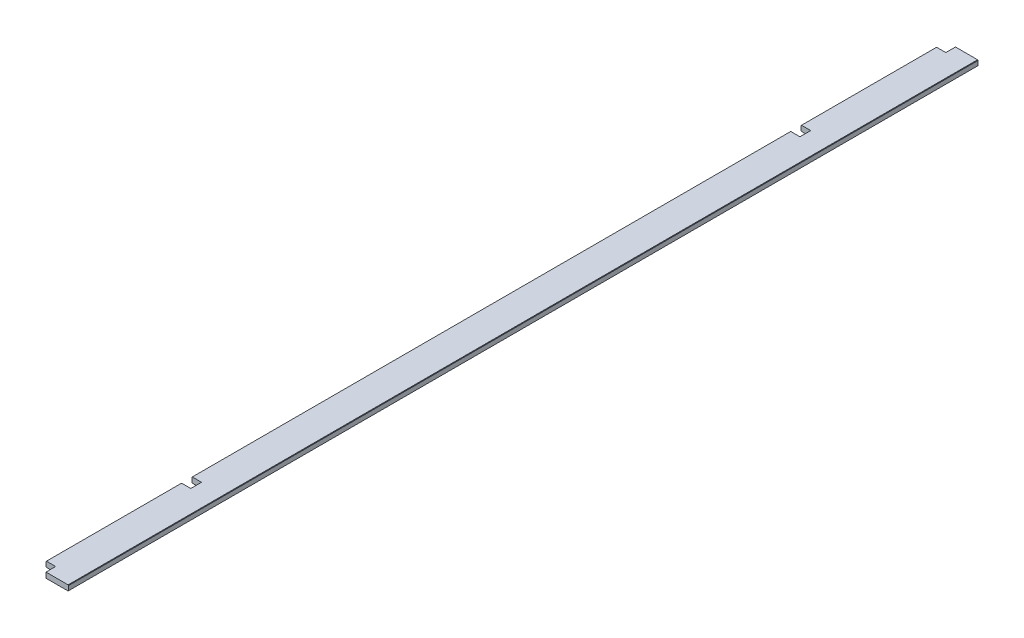
ISO-10303-21;
HEADER;
FILE_DESCRIPTION(('STEP AP214'),'2;1');
FILE_NAME('part.step','',(''),(''),'','','');
FILE_SCHEMA(('AUTOMOTIVE_DESIGN { 1 0 10303 214 1 1 1 1 }'));
ENDSEC;
DATA;
#1=APPLICATION_CONTEXT('core data for automotive mechanical design processes');
#2=APPLICATION_PROTOCOL_DEFINITION('international standard','automotive_design',2000,#1);
#3=PRODUCT_CONTEXT('',#1,'mechanical');
#4=PRODUCT('Part','Part','',(#3));
#5=PRODUCT_RELATED_PRODUCT_CATEGORY('part','',(#4));
#6=PRODUCT_DEFINITION_FORMATION('','',#4);
#7=PRODUCT_DEFINITION_CONTEXT('part definition',#1,'design');
#8=PRODUCT_DEFINITION('design','',#6,#7);
#9=PRODUCT_DEFINITION_SHAPE('','',#8);
#10=(LENGTH_UNIT() NAMED_UNIT(*) SI_UNIT(.MILLI.,.METRE.));
#11=(NAMED_UNIT(*) PLANE_ANGLE_UNIT() SI_UNIT($,.RADIAN.));
#12=(NAMED_UNIT(*) SI_UNIT($,.STERADIAN.) SOLID_ANGLE_UNIT());
#13=UNCERTAINTY_MEASURE_WITH_UNIT(LENGTH_MEASURE(1.E-05),#10,'distance_accuracy_value','');
#14=(GEOMETRIC_REPRESENTATION_CONTEXT(3) GLOBAL_UNCERTAINTY_ASSIGNED_CONTEXT((#13)) GLOBAL_UNIT_ASSIGNED_CONTEXT((#10,
#11,#12)) REPRESENTATION_CONTEXT('',''));
#15=CARTESIAN_POINT('',(0.,0.,0.));
#16=DIRECTION('',(0.,0.,1.));
#17=DIRECTION('',(1.,0.,0.));
#18=AXIS2_PLACEMENT_3D('',#15,#16,#17);
#19=CARTESIAN_POINT('',(-75.,10.5,4240.));
#20=DIRECTION('',(0.707106781186547,-0.707106781186548,0.));
#21=DIRECTION('',(0.707106781186548,0.707106781186547,0.));
#22=AXIS2_PLACEMENT_3D('',#19,#20,#21);
#23=PLANE('',#22);
#24=DIRECTION('',(0.,0.,-1.));
#25=VECTOR('',#24,1.);
#26=CARTESIAN_POINT('',(-75.,10.5,4240.));
#27=LINE('',#26,#25);
#28=CARTESIAN_POINT('',(-75.,10.5,3515.));
#29=VERTEX_POINT('',#28);
#30=CARTESIAN_POINT('',(-75.,10.5,725.));
#31=VERTEX_POINT('',#30);
#32=EDGE_CURVE('E367',#29,#31,#27,.T.);
#33=ORIENTED_EDGE('',*,*,#32,.F.);
#34=DIRECTION('',(0.707106781186548,0.707106781186547,0.));
#35=VECTOR('',#34,1.);
#36=CARTESIAN_POINT('',(-75.,10.5,3515.));
#37=LINE('',#36,#35);
#38=CARTESIAN_POINT('',(-73.,12.5,3515.));
#39=VERTEX_POINT('',#38);
#40=EDGE_CURVE('E314',#29,#39,#37,.T.);
#41=ORIENTED_EDGE('',*,*,#40,.T.);
#42=DIRECTION('',(0.,0.,-1.));
#43=VECTOR('',#42,1.);
#44=CARTESIAN_POINT('',(-73.,12.5,4240.));
#45=LINE('',#44,#43);
#46=CARTESIAN_POINT('',(-73.,12.5,725.));
#47=VERTEX_POINT('',#46);
#48=EDGE_CURVE('E371',#39,#47,#45,.T.);
#49=ORIENTED_EDGE('',*,*,#48,.T.);
#50=DIRECTION('',(-0.707106781186548,-0.707106781186547,0.));
#51=VECTOR('',#50,1.);
#52=CARTESIAN_POINT('',(-75.,10.5,725.));
#53=LINE('',#52,#51);
#54=EDGE_CURVE('E296',#47,#31,#53,.T.);
#55=ORIENTED_EDGE('',*,*,#54,.T.);
#56=EDGE_LOOP('',(#33,#41,#49,#55));
#57=FACE_BOUND('',#56,.T.);
#58=ADVANCED_FACE('F36',(#57),#23,.F.);
#59=CARTESIAN_POINT('',(-73.,12.5,675.));
#60=VERTEX_POINT('',#59);
#61=CARTESIAN_POINT('',(-73.,12.5,45.));
#62=VERTEX_POINT('',#61);
#63=EDGE_CURVE('E369',#60,#62,#45,.T.);
#64=ORIENTED_EDGE('',*,*,#63,.T.);
#65=DIRECTION('',(-0.707106781186548,-0.707106781186547,0.));
#66=VECTOR('',#65,1.);
#67=CARTESIAN_POINT('',(-75.,10.5,44.9999999999999));
#68=LINE('',#67,#66);
#69=CARTESIAN_POINT('',(-75.,10.5,45.));
#70=VERTEX_POINT('',#69);
#71=EDGE_CURVE('E319',#62,#70,#68,.T.);
#72=ORIENTED_EDGE('',*,*,#71,.T.);
#73=CARTESIAN_POINT('',(-75.,10.5,675.));
#74=VERTEX_POINT('',#73);
#75=EDGE_CURVE('E364',#74,#70,#27,.T.);
#76=ORIENTED_EDGE('',*,*,#75,.F.);
#77=DIRECTION('',(0.707106781186548,0.707106781186547,0.));
#78=VECTOR('',#77,1.);
#79=CARTESIAN_POINT('',(-75.,10.5,675.));
#80=LINE('',#79,#78);
#81=EDGE_CURVE('E302',#74,#60,#80,.T.);
#82=ORIENTED_EDGE('',*,*,#81,.T.);
#83=EDGE_LOOP('',(#64,#72,#76,#82));
#84=FACE_BOUND('',#83,.T.);
#85=ADVANCED_FACE('F398',(#84),#23,.F.);
#86=CARTESIAN_POINT('',(-75.,10.5,4240.));
#87=DIRECTION('',(1.,0.,0.));
#88=DIRECTION('',(0.,0.,-1.));
#89=AXIS2_PLACEMENT_3D('',#86,#87,#88);
#90=PLANE('',#89);
#91=DIRECTION('',(0.,0.,-1.));
#92=VECTOR('',#91,1.);
#93=CARTESIAN_POINT('',(-75.,-10.5,4240.));
#94=LINE('',#93,#92);
#95=CARTESIAN_POINT('',(-75.,-10.5,3515.));
#96=VERTEX_POINT('',#95);
#97=CARTESIAN_POINT('',(-75.,-10.5,725.));
#98=VERTEX_POINT('',#97);
#99=EDGE_CURVE('E362',#96,#98,#94,.T.);
#100=ORIENTED_EDGE('',*,*,#99,.F.);
#101=DIRECTION('',(0.,1.,0.));
#102=VECTOR('',#101,1.);
#103=CARTESIAN_POINT('',(-75.,-12.5,3515.));
#104=LINE('',#103,#102);
#105=EDGE_CURVE('E244',#96,#29,#104,.T.);
#106=ORIENTED_EDGE('',*,*,#105,.T.);
#107=ORIENTED_EDGE('',*,*,#32,.T.);
#108=DIRECTION('',(0.,1.,0.));
#109=VECTOR('',#108,1.);
#110=CARTESIAN_POINT('',(-75.,-12.5,725.));
#111=LINE('',#110,#109);
#112=EDGE_CURVE('E275',#98,#31,#111,.T.);
#113=ORIENTED_EDGE('',*,*,#112,.F.);
#114=EDGE_LOOP('',(#100,#106,#107,#113));
#115=FACE_BOUND('',#114,.T.);
#116=ADVANCED_FACE('F447',(#115),#90,.F.);
#117=ORIENTED_EDGE('',*,*,#75,.T.);
#118=DIRECTION('',(0.,1.,0.));
#119=VECTOR('',#118,1.);
#120=CARTESIAN_POINT('',(-75.,-12.5,45.));
#121=LINE('',#120,#119);
#122=CARTESIAN_POINT('',(-75.,-10.5,45.));
#123=VERTEX_POINT('',#122);
#124=EDGE_CURVE('E209',#123,#70,#121,.T.);
#125=ORIENTED_EDGE('',*,*,#124,.F.);
#126=CARTESIAN_POINT('',(-75.,-10.5,675.));
#127=VERTEX_POINT('',#126);
#128=EDGE_CURVE('E359',#127,#123,#94,.T.);
#129=ORIENTED_EDGE('',*,*,#128,.F.);
#130=DIRECTION('',(0.,1.,0.));
#131=VECTOR('',#130,1.);
#132=CARTESIAN_POINT('',(-75.,-12.5,675.));
#133=LINE('',#132,#131);
#134=EDGE_CURVE('E264',#127,#74,#133,.T.);
#135=ORIENTED_EDGE('',*,*,#134,.T.);
#136=EDGE_LOOP('',(#117,#125,#129,#135));
#137=FACE_BOUND('',#136,.T.);
#138=ADVANCED_FACE('F401',(#137),#90,.F.);
#139=CARTESIAN_POINT('',(-75.,-10.5,4240.));
#140=DIRECTION('',(0.707106781186547,0.707106781186548,0.));
#141=DIRECTION('',(-0.707106781186548,0.707106781186547,0.));
#142=AXIS2_PLACEMENT_3D('',#139,#140,#141);
#143=PLANE('',#142);
#144=DIRECTION('',(0.,0.,-1.));
#145=VECTOR('',#144,1.);
#146=CARTESIAN_POINT('',(-73.,-12.5,4240.));
#147=LINE('',#146,#145);
#148=CARTESIAN_POINT('',(-73.,-12.5,3515.));
#149=VERTEX_POINT('',#148);
#150=CARTESIAN_POINT('',(-73.,-12.5,725.));
#151=VERTEX_POINT('',#150);
#152=EDGE_CURVE('E357',#149,#151,#147,.T.);
#153=ORIENTED_EDGE('',*,*,#152,.F.);
#154=DIRECTION('',(-0.707106781186548,0.707106781186547,0.));
#155=VECTOR('',#154,1.);
#156=CARTESIAN_POINT('',(-75.,-10.5,3515.));
#157=LINE('',#156,#155);
#158=EDGE_CURVE('E311',#149,#96,#157,.T.);
#159=ORIENTED_EDGE('',*,*,#158,.T.);
#160=ORIENTED_EDGE('',*,*,#99,.T.);
#161=DIRECTION('',(0.707106781186548,-0.707106781186547,0.));
#162=VECTOR('',#161,1.);
#163=CARTESIAN_POINT('',(-75.,-10.5,725.));
#164=LINE('',#163,#162);
#165=EDGE_CURVE('E293',#98,#151,#164,.T.);
#166=ORIENTED_EDGE('',*,*,#165,.T.);
#167=EDGE_LOOP('',(#153,#159,#160,#166));
#168=FACE_BOUND('',#167,.T.);
#169=ADVANCED_FACE('F444',(#168),#143,.F.);
#170=ORIENTED_EDGE('',*,*,#128,.T.);
#171=DIRECTION('',(0.707106781186548,-0.707106781186547,0.));
#172=VECTOR('',#171,1.);
#173=CARTESIAN_POINT('',(-75.,-10.5,44.9999999999999));
#174=LINE('',#173,#172);
#175=CARTESIAN_POINT('',(-73.,-12.5,45.));
#176=VERTEX_POINT('',#175);
#177=EDGE_CURVE('E317',#123,#176,#174,.T.);
#178=ORIENTED_EDGE('',*,*,#177,.T.);
#179=CARTESIAN_POINT('',(-73.,-12.5,675.));
#180=VERTEX_POINT('',#179);
#181=EDGE_CURVE('E222',#180,#176,#147,.T.);
#182=ORIENTED_EDGE('',*,*,#181,.F.);
#183=DIRECTION('',(-0.707106781186548,0.707106781186547,0.));
#184=VECTOR('',#183,1.);
#185=CARTESIAN_POINT('',(-75.,-10.5,675.));
#186=LINE('',#185,#184);
#187=EDGE_CURVE('E299',#180,#127,#186,.T.);
#188=ORIENTED_EDGE('',*,*,#187,.T.);
#189=EDGE_LOOP('',(#170,#178,#182,#188));
#190=FACE_BOUND('',#189,.T.);
#191=ADVANCED_FACE('F404',(#190),#143,.F.);
#192=CARTESIAN_POINT('',(-73.,12.5,4240.));
#193=DIRECTION('',(0.,-1.,0.));
#194=DIRECTION('',(0.,0.,-1.));
#195=AXIS2_PLACEMENT_3D('',#192,#193,#194);
#196=PLANE('',#195);
#197=DIRECTION('',(-1.,0.,0.));
#198=VECTOR('',#197,1.);
#199=CARTESIAN_POINT('',(-73.,12.5,0.));
#200=LINE('',#199,#198);
#201=CARTESIAN_POINT('',(73.,12.5,0.));
#202=VERTEX_POINT('',#201);
#203=CARTESIAN_POINT('',(-30.,12.5,0.));
#204=VERTEX_POINT('',#203);
#205=EDGE_CURVE('E322',#202,#204,#200,.T.);
#206=ORIENTED_EDGE('',*,*,#205,.T.);
#207=DIRECTION('',(0.,0.,-1.));
#208=VECTOR('',#207,1.);
#209=CARTESIAN_POINT('',(-30.,12.5,0.));
#210=LINE('',#209,#208);
#211=CARTESIAN_POINT('',(-30.,12.5,45.));
#212=VERTEX_POINT('',#211);
#213=EDGE_CURVE('E223',#212,#204,#210,.T.);
#214=ORIENTED_EDGE('',*,*,#213,.F.);
#215=DIRECTION('',(1.,0.,0.));
#216=VECTOR('',#215,1.);
#217=CARTESIAN_POINT('',(-75.,12.5,45.));
#218=LINE('',#217,#216);
#219=EDGE_CURVE('E205',#62,#212,#218,.T.);
#220=ORIENTED_EDGE('',*,*,#219,.F.);
#221=ORIENTED_EDGE('',*,*,#63,.F.);
#222=DIRECTION('',(-1.,0.,0.));
#223=VECTOR('',#222,1.);
#224=CARTESIAN_POINT('',(-75.,12.5,675.));
#225=LINE('',#224,#223);
#226=CARTESIAN_POINT('',(-30.,12.5,675.));
#227=VERTEX_POINT('',#226);
#228=EDGE_CURVE('E273',#227,#60,#225,.T.);
#229=ORIENTED_EDGE('',*,*,#228,.F.);
#230=DIRECTION('',(0.,0.,-1.));
#231=VECTOR('',#230,1.);
#232=CARTESIAN_POINT('',(-30.,12.5,675.));
#233=LINE('',#232,#231);
#234=CARTESIAN_POINT('',(-30.,12.5,725.));
#235=VERTEX_POINT('',#234);
#236=EDGE_CURVE('E277',#235,#227,#233,.T.);
#237=ORIENTED_EDGE('',*,*,#236,.F.);
#238=DIRECTION('',(1.,0.,0.));
#239=VECTOR('',#238,1.);
#240=CARTESIAN_POINT('',(-75.,12.5,725.));
#241=LINE('',#240,#239);
#242=EDGE_CURVE('E247',#47,#235,#241,.T.);
#243=ORIENTED_EDGE('',*,*,#242,.F.);
#244=ORIENTED_EDGE('',*,*,#48,.F.);
#245=DIRECTION('',(-1.,0.,0.));
#246=VECTOR('',#245,1.);
#247=CARTESIAN_POINT('',(-75.,12.5,3515.));
#248=LINE('',#247,#246);
#249=CARTESIAN_POINT('',(-30.,12.5,3515.));
#250=VERTEX_POINT('',#249);
#251=EDGE_CURVE('E234',#250,#39,#248,.T.);
#252=ORIENTED_EDGE('',*,*,#251,.F.);
#253=DIRECTION('',(0.,0.,-1.));
#254=VECTOR('',#253,1.);
#255=CARTESIAN_POINT('',(-30.,12.5,3565.));
#256=LINE('',#255,#254);
#257=CARTESIAN_POINT('',(-30.,12.5,3565.));
#258=VERTEX_POINT('',#257);
#259=EDGE_CURVE('E240',#258,#250,#256,.T.);
#260=ORIENTED_EDGE('',*,*,#259,.F.);
#261=DIRECTION('',(1.,0.,0.));
#262=VECTOR('',#261,1.);
#263=CARTESIAN_POINT('',(-75.,12.5,3565.));
#264=LINE('',#263,#262);
#265=CARTESIAN_POINT('',(-73.,12.5,3565.));
#266=VERTEX_POINT('',#265);
#267=EDGE_CURVE('E238',#266,#258,#264,.T.);
#268=ORIENTED_EDGE('',*,*,#267,.F.);
#269=CARTESIAN_POINT('',(-73.,12.5,4195.));
#270=VERTEX_POINT('',#269);
#271=EDGE_CURVE('E372',#270,#266,#45,.T.);
#272=ORIENTED_EDGE('',*,*,#271,.F.);
#273=DIRECTION('',(-1.,0.,0.));
#274=VECTOR('',#273,1.);
#275=CARTESIAN_POINT('',(-75.,12.5,4195.));
#276=LINE('',#275,#274);
#277=CARTESIAN_POINT('',(-30.,12.5,4195.));
#278=VERTEX_POINT('',#277);
#279=EDGE_CURVE('E257',#278,#270,#276,.T.);
#280=ORIENTED_EDGE('',*,*,#279,.F.);
#281=DIRECTION('',(0.,0.,-1.));
#282=VECTOR('',#281,1.);
#283=CARTESIAN_POINT('',(-30.,12.5,4240.));
#284=LINE('',#283,#282);
#285=CARTESIAN_POINT('',(-30.,12.5,4240.));
#286=VERTEX_POINT('',#285);
#287=EDGE_CURVE('E261',#286,#278,#284,.T.);
#288=ORIENTED_EDGE('',*,*,#287,.F.);
#289=DIRECTION('',(-1.,0.,0.));
#290=VECTOR('',#289,1.);
#291=CARTESIAN_POINT('',(-73.,12.5,4240.));
#292=LINE('',#291,#290);
#293=CARTESIAN_POINT('',(73.,12.5,4240.));
#294=VERTEX_POINT('',#293);
#295=EDGE_CURVE('E323',#294,#286,#292,.T.);
#296=ORIENTED_EDGE('',*,*,#295,.F.);
#297=DIRECTION('',(0.,0.,-1.));
#298=VECTOR('',#297,1.);
#299=CARTESIAN_POINT('',(73.,12.5,4240.));
#300=LINE('',#299,#298);
#301=EDGE_CURVE('E335',#294,#202,#300,.T.);
#302=ORIENTED_EDGE('',*,*,#301,.T.);
#303=EDGE_LOOP('',(#206,#214,#220,#221,#229,#237,#243,#244,#252,#260,#268,#272,#280,#288,#296,#302));
#304=FACE_BOUND('',#303,.T.);
#305=ADVANCED_FACE('F38',(#304),#196,.F.);
#306=ORIENTED_EDGE('',*,*,#271,.T.);
#307=DIRECTION('',(-0.707106781186548,-0.707106781186547,0.));
#308=VECTOR('',#307,1.);
#309=CARTESIAN_POINT('',(-75.,10.5,3565.));
#310=LINE('',#309,#308);
#311=CARTESIAN_POINT('',(-75.,10.5,3565.));
#312=VERTEX_POINT('',#311);
#313=EDGE_CURVE('E308',#266,#312,#310,.T.);
#314=ORIENTED_EDGE('',*,*,#313,.T.);
#315=CARTESIAN_POINT('',(-75.,10.5,4195.));
#316=VERTEX_POINT('',#315);
#317=EDGE_CURVE('E368',#316,#312,#27,.T.);
#318=ORIENTED_EDGE('',*,*,#317,.F.);
#319=DIRECTION('',(0.707106781186548,0.707106781186547,0.));
#320=VECTOR('',#319,1.);
#321=CARTESIAN_POINT('',(-75.,10.5,4195.));
#322=LINE('',#321,#320);
#323=EDGE_CURVE('E290',#316,#270,#322,.T.);
#324=ORIENTED_EDGE('',*,*,#323,.T.);
#325=EDGE_LOOP('',(#306,#314,#318,#324));
#326=FACE_BOUND('',#325,.T.);
#327=ADVANCED_FACE('F448',(#326),#23,.F.);
#328=ORIENTED_EDGE('',*,*,#317,.T.);
#329=DIRECTION('',(0.,1.,0.));
#330=VECTOR('',#329,1.);
#331=CARTESIAN_POINT('',(-75.,-12.5,3565.));
#332=LINE('',#331,#330);
#333=CARTESIAN_POINT('',(-75.,-10.5,3565.));
#334=VERTEX_POINT('',#333);
#335=EDGE_CURVE('E237',#334,#312,#332,.T.);
#336=ORIENTED_EDGE('',*,*,#335,.F.);
#337=CARTESIAN_POINT('',(-75.,-10.5,4195.));
#338=VERTEX_POINT('',#337);
#339=EDGE_CURVE('E363',#338,#334,#94,.T.);
#340=ORIENTED_EDGE('',*,*,#339,.F.);
#341=DIRECTION('',(0.,1.,0.));
#342=VECTOR('',#341,1.);
#343=CARTESIAN_POINT('',(-75.,-12.5,4195.));
#344=LINE('',#343,#342);
#345=EDGE_CURVE('E227',#338,#316,#344,.T.);
#346=ORIENTED_EDGE('',*,*,#345,.T.);
#347=EDGE_LOOP('',(#328,#336,#340,#346));
#348=FACE_BOUND('',#347,.T.);
#349=ADVANCED_FACE('F438',(#348),#90,.F.);
#350=ORIENTED_EDGE('',*,*,#339,.T.);
#351=DIRECTION('',(0.707106781186548,-0.707106781186547,0.));
#352=VECTOR('',#351,1.);
#353=CARTESIAN_POINT('',(-75.,-10.5,3565.));
#354=LINE('',#353,#352);
#355=CARTESIAN_POINT('',(-73.,-12.5,3565.));
#356=VERTEX_POINT('',#355);
#357=EDGE_CURVE('E305',#334,#356,#354,.T.);
#358=ORIENTED_EDGE('',*,*,#357,.T.);
#359=CARTESIAN_POINT('',(-73.,-12.5,4195.));
#360=VERTEX_POINT('',#359);
#361=EDGE_CURVE('E358',#360,#356,#147,.T.);
#362=ORIENTED_EDGE('',*,*,#361,.F.);
#363=DIRECTION('',(-0.707106781186548,0.707106781186547,0.));
#364=VECTOR('',#363,1.);
#365=CARTESIAN_POINT('',(-75.,-10.5,4195.));
#366=LINE('',#365,#364);
#367=EDGE_CURVE('E229',#360,#338,#366,.T.);
#368=ORIENTED_EDGE('',*,*,#367,.T.);
#369=EDGE_LOOP('',(#350,#358,#362,#368));
#370=FACE_BOUND('',#369,.T.);
#371=ADVANCED_FACE('F434',(#370),#143,.F.);
#372=CARTESIAN_POINT('',(-73.,-12.5,4240.));
#373=DIRECTION('',(0.,1.,0.));
#374=DIRECTION('',(0.,0.,1.));
#375=AXIS2_PLACEMENT_3D('',#372,#373,#374);
#376=PLANE('',#375);
#377=DIRECTION('',(1.,0.,0.));
#378=VECTOR('',#377,1.);
#379=CARTESIAN_POINT('',(-75.,-12.5,45.));
#380=LINE('',#379,#378);
#381=CARTESIAN_POINT('',(-30.,-12.5,45.));
#382=VERTEX_POINT('',#381);
#383=EDGE_CURVE('E202',#176,#382,#380,.T.);
#384=ORIENTED_EDGE('',*,*,#383,.T.);
#385=DIRECTION('',(0.,0.,-1.));
#386=VECTOR('',#385,1.);
#387=CARTESIAN_POINT('',(-30.,-12.5,0.));
#388=LINE('',#387,#386);
#389=CARTESIAN_POINT('',(-30.,-12.5,0.));
#390=VERTEX_POINT('',#389);
#391=EDGE_CURVE('E212',#382,#390,#388,.T.);
#392=ORIENTED_EDGE('',*,*,#391,.T.);
#393=DIRECTION('',(1.,0.,0.));
#394=VECTOR('',#393,1.);
#395=CARTESIAN_POINT('',(-73.,-12.5,0.));
#396=LINE('',#395,#394);
#397=CARTESIAN_POINT('',(73.,-12.5,0.));
#398=VERTEX_POINT('',#397);
#399=EDGE_CURVE('E338',#390,#398,#396,.T.);
#400=ORIENTED_EDGE('',*,*,#399,.T.);
#401=DIRECTION('',(0.,0.,-1.));
#402=VECTOR('',#401,1.);
#403=CARTESIAN_POINT('',(73.,-12.5,4240.));
#404=LINE('',#403,#402);
#405=CARTESIAN_POINT('',(73.,-12.5,4240.));
#406=VERTEX_POINT('',#405);
#407=EDGE_CURVE('E353',#406,#398,#404,.T.);
#408=ORIENTED_EDGE('',*,*,#407,.F.);
#409=DIRECTION('',(1.,0.,0.));
#410=VECTOR('',#409,1.);
#411=CARTESIAN_POINT('',(-73.,-12.5,4240.));
#412=LINE('',#411,#410);
#413=CARTESIAN_POINT('',(-30.,-12.5,4240.));
#414=VERTEX_POINT('',#413);
#415=EDGE_CURVE('E326',#414,#406,#412,.T.);
#416=ORIENTED_EDGE('',*,*,#415,.F.);
#417=DIRECTION('',(0.,0.,-1.));
#418=VECTOR('',#417,1.);
#419=CARTESIAN_POINT('',(-30.,-12.5,4240.));
#420=LINE('',#419,#418);
#421=CARTESIAN_POINT('',(-30.,-12.5,4195.));
#422=VERTEX_POINT('',#421);
#423=EDGE_CURVE('E253',#414,#422,#420,.T.);
#424=ORIENTED_EDGE('',*,*,#423,.T.);
#425=DIRECTION('',(-1.,0.,0.));
#426=VECTOR('',#425,1.);
#427=CARTESIAN_POINT('',(-75.,-12.5,4195.));
#428=LINE('',#427,#426);
#429=EDGE_CURVE('E256',#422,#360,#428,.T.);
#430=ORIENTED_EDGE('',*,*,#429,.T.);
#431=ORIENTED_EDGE('',*,*,#361,.T.);
#432=DIRECTION('',(1.,0.,0.));
#433=VECTOR('',#432,1.);
#434=CARTESIAN_POINT('',(-73.,-12.5,3565.));
#435=LINE('',#434,#433);
#436=CARTESIAN_POINT('',(-30.,-12.5,3565.));
#437=VERTEX_POINT('',#436);
#438=EDGE_CURVE('E11',#356,#437,#435,.T.);
#439=ORIENTED_EDGE('',*,*,#438,.T.);
#440=DIRECTION('',(0.,0.,-1.));
#441=VECTOR('',#440,1.);
#442=CARTESIAN_POINT('',(-30.,-12.5,3565.));
#443=LINE('',#442,#441);
#444=CARTESIAN_POINT('',(-30.,-12.5,3515.));
#445=VERTEX_POINT('',#444);
#446=EDGE_CURVE('E51',#437,#445,#443,.T.);
#447=ORIENTED_EDGE('',*,*,#446,.T.);
#448=DIRECTION('',(-1.,0.,0.));
#449=VECTOR('',#448,1.);
#450=CARTESIAN_POINT('',(-75.,-12.5,3515.));
#451=LINE('',#450,#449);
#452=EDGE_CURVE('E233',#445,#149,#451,.T.);
#453=ORIENTED_EDGE('',*,*,#452,.T.);
#454=ORIENTED_EDGE('',*,*,#152,.T.);
#455=DIRECTION('',(1.,0.,0.));
#456=VECTOR('',#455,1.);
#457=CARTESIAN_POINT('',(-73.,-12.5,725.));
#458=LINE('',#457,#456);
#459=CARTESIAN_POINT('',(-30.,-12.5,725.));
#460=VERTEX_POINT('',#459);
#461=EDGE_CURVE('E44',#151,#460,#458,.T.);
#462=ORIENTED_EDGE('',*,*,#461,.T.);
#463=DIRECTION('',(0.,0.,-1.));
#464=VECTOR('',#463,1.);
#465=CARTESIAN_POINT('',(-30.,-12.5,675.));
#466=LINE('',#465,#464);
#467=CARTESIAN_POINT('',(-30.,-12.5,675.));
#468=VERTEX_POINT('',#467);
#469=EDGE_CURVE('E59',#460,#468,#466,.T.);
#470=ORIENTED_EDGE('',*,*,#469,.T.);
#471=DIRECTION('',(-1.,0.,0.));
#472=VECTOR('',#471,1.);
#473=CARTESIAN_POINT('',(-75.,-12.5,675.));
#474=LINE('',#473,#472);
#475=EDGE_CURVE('E272',#468,#180,#474,.T.);
#476=ORIENTED_EDGE('',*,*,#475,.T.);
#477=ORIENTED_EDGE('',*,*,#181,.T.);
#478=EDGE_LOOP('',(#384,#392,#400,#408,#416,#424,#430,#431,#439,#447,#453,#454,#462,#470,#476,#477));
#479=FACE_BOUND('',#478,.T.);
#480=ADVANCED_FACE('F219',(#479),#376,.F.);
#481=CARTESIAN_POINT('',(73.,-12.5,4240.));
#482=DIRECTION('',(-0.707106781186547,0.707106781186548,0.));
#483=DIRECTION('',(-0.707106781186548,-0.707106781186547,0.));
#484=AXIS2_PLACEMENT_3D('',#481,#482,#483);
#485=PLANE('',#484);
#486=DIRECTION('',(0.707106781186548,0.707106781186547,0.));
#487=VECTOR('',#486,1.);
#488=CARTESIAN_POINT('',(73.,-12.5,0.));
#489=LINE('',#488,#487);
#490=CARTESIAN_POINT('',(75.,-10.5,0.));
#491=VERTEX_POINT('',#490);
#492=EDGE_CURVE('E340',#398,#491,#489,.T.);
#493=ORIENTED_EDGE('',*,*,#492,.T.);
#494=DIRECTION('',(0.,0.,-1.));
#495=VECTOR('',#494,1.);
#496=CARTESIAN_POINT('',(75.,-10.5,4240.));
#497=LINE('',#496,#495);
#498=CARTESIAN_POINT('',(75.,-10.5,4240.));
#499=VERTEX_POINT('',#498);
#500=EDGE_CURVE('E350',#499,#491,#497,.T.);
#501=ORIENTED_EDGE('',*,*,#500,.F.);
#502=DIRECTION('',(0.707106781186548,0.707106781186547,0.));
#503=VECTOR('',#502,1.);
#504=CARTESIAN_POINT('',(73.,-12.5,4240.));
#505=LINE('',#504,#503);
#506=EDGE_CURVE('E329',#406,#499,#505,.T.);
#507=ORIENTED_EDGE('',*,*,#506,.F.);
#508=ORIENTED_EDGE('',*,*,#407,.T.);
#509=EDGE_LOOP('',(#493,#501,#507,#508));
#510=FACE_BOUND('',#509,.T.);
#511=ADVANCED_FACE('F415',(#510),#485,.F.);
#512=CARTESIAN_POINT('',(75.,10.5,4240.));
#513=DIRECTION('',(-1.,0.,0.));
#514=DIRECTION('',(0.,0.,1.));
#515=AXIS2_PLACEMENT_3D('',#512,#513,#514);
#516=PLANE('',#515);
#517=DIRECTION('',(0.,1.,0.));
#518=VECTOR('',#517,1.);
#519=CARTESIAN_POINT('',(75.,10.5,0.));
#520=LINE('',#519,#518);
#521=CARTESIAN_POINT('',(75.,10.5,0.));
#522=VERTEX_POINT('',#521);
#523=EDGE_CURVE('E342',#491,#522,#520,.T.);
#524=ORIENTED_EDGE('',*,*,#523,.T.);
#525=DIRECTION('',(0.,0.,-1.));
#526=VECTOR('',#525,1.);
#527=CARTESIAN_POINT('',(75.,10.5,4240.));
#528=LINE('',#527,#526);
#529=CARTESIAN_POINT('',(75.,10.5,4240.));
#530=VERTEX_POINT('',#529);
#531=EDGE_CURVE('E347',#530,#522,#528,.T.);
#532=ORIENTED_EDGE('',*,*,#531,.F.);
#533=DIRECTION('',(0.,1.,0.));
#534=VECTOR('',#533,1.);
#535=CARTESIAN_POINT('',(75.,10.5,4240.));
#536=LINE('',#535,#534);
#537=EDGE_CURVE('E331',#499,#530,#536,.T.);
#538=ORIENTED_EDGE('',*,*,#537,.F.);
#539=ORIENTED_EDGE('',*,*,#500,.T.);
#540=EDGE_LOOP('',(#524,#532,#538,#539));
#541=FACE_BOUND('',#540,.T.);
#542=ADVANCED_FACE('F491',(#541),#516,.F.);
#543=CARTESIAN_POINT('',(73.,12.5,4240.));
#544=DIRECTION('',(-0.707106781186547,-0.707106781186548,0.));
#545=DIRECTION('',(0.707106781186548,-0.707106781186547,0.));
#546=AXIS2_PLACEMENT_3D('',#543,#544,#545);
#547=PLANE('',#546);
#548=DIRECTION('',(-0.707106781186548,0.707106781186547,0.));
#549=VECTOR('',#548,1.);
#550=CARTESIAN_POINT('',(73.,12.5,0.));
#551=LINE('',#550,#549);
#552=EDGE_CURVE('E327',#522,#202,#551,.T.);
#553=ORIENTED_EDGE('',*,*,#552,.T.);
#554=ORIENTED_EDGE('',*,*,#301,.F.);
#555=DIRECTION('',(-0.707106781186548,0.707106781186547,0.));
#556=VECTOR('',#555,1.);
#557=CARTESIAN_POINT('',(73.,12.5,4240.));
#558=LINE('',#557,#556);
#559=EDGE_CURVE('E333',#530,#294,#558,.T.);
#560=ORIENTED_EDGE('',*,*,#559,.F.);
#561=ORIENTED_EDGE('',*,*,#531,.T.);
#562=EDGE_LOOP('',(#553,#554,#560,#561));
#563=FACE_BOUND('',#562,.T.);
#564=ADVANCED_FACE('F496',(#563),#547,.F.);
#565=CARTESIAN_POINT('',(0.,0.,4240.));
#566=DIRECTION('',(0.,0.,-1.));
#567=DIRECTION('',(-1.,0.,0.));
#568=AXIS2_PLACEMENT_3D('',#565,#566,#567);
#569=PLANE('',#568);
#570=ORIENTED_EDGE('',*,*,#295,.T.);
#571=DIRECTION('',(0.,1.,0.));
#572=VECTOR('',#571,1.);
#573=CARTESIAN_POINT('',(-30.,-12.5,4240.));
#574=LINE('',#573,#572);
#575=EDGE_CURVE('E260',#414,#286,#574,.T.);
#576=ORIENTED_EDGE('',*,*,#575,.F.);
#577=ORIENTED_EDGE('',*,*,#415,.T.);
#578=ORIENTED_EDGE('',*,*,#506,.T.);
#579=ORIENTED_EDGE('',*,*,#537,.T.);
#580=ORIENTED_EDGE('',*,*,#559,.T.);
#581=EDGE_LOOP('',(#570,#576,#577,#578,#579,#580));
#582=FACE_BOUND('',#581,.T.);
#583=ADVANCED_FACE('F419',(#582),#569,.F.);
#584=CARTESIAN_POINT('',(0.,0.,0.));
#585=DIRECTION('',(0.,0.,-1.));
#586=DIRECTION('',(-1.,0.,0.));
#587=AXIS2_PLACEMENT_3D('',#584,#585,#586);
#588=PLANE('',#587);
#589=DIRECTION('',(0.,1.,0.));
#590=VECTOR('',#589,1.);
#591=CARTESIAN_POINT('',(-30.,-12.5,0.));
#592=LINE('',#591,#590);
#593=EDGE_CURVE('E208',#390,#204,#592,.T.);
#594=ORIENTED_EDGE('',*,*,#593,.T.);
#595=ORIENTED_EDGE('',*,*,#205,.F.);
#596=ORIENTED_EDGE('',*,*,#552,.F.);
#597=ORIENTED_EDGE('',*,*,#523,.F.);
#598=ORIENTED_EDGE('',*,*,#492,.F.);
#599=ORIENTED_EDGE('',*,*,#399,.F.);
#600=EDGE_LOOP('',(#594,#595,#596,#597,#598,#599));
#601=FACE_BOUND('',#600,.T.);
#602=ADVANCED_FACE('F407',(#601),#588,.T.);
#603=CARTESIAN_POINT('',(-75.,-12.5,45.));
#604=DIRECTION('',(0.,0.,1.));
#605=DIRECTION('',(1.,0.,0.));
#606=AXIS2_PLACEMENT_3D('',#603,#604,#605);
#607=PLANE('',#606);
#608=ORIENTED_EDGE('',*,*,#219,.T.);
#609=DIRECTION('',(0.,1.,0.));
#610=VECTOR('',#609,1.);
#611=CARTESIAN_POINT('',(-30.,-12.5,45.));
#612=LINE('',#611,#610);
#613=EDGE_CURVE('E198',#382,#212,#612,.T.);
#614=ORIENTED_EDGE('',*,*,#613,.F.);
#615=ORIENTED_EDGE('',*,*,#383,.F.);
#616=ORIENTED_EDGE('',*,*,#177,.F.);
#617=ORIENTED_EDGE('',*,*,#124,.T.);
#618=ORIENTED_EDGE('',*,*,#71,.F.);
#619=EDGE_LOOP('',(#608,#614,#615,#616,#617,#618));
#620=FACE_BOUND('',#619,.T.);
#621=ADVANCED_FACE('F200',(#620),#607,.F.);
#622=CARTESIAN_POINT('',(-30.,-12.5,0.));
#623=DIRECTION('',(1.,0.,0.));
#624=DIRECTION('',(0.,0.,-1.));
#625=AXIS2_PLACEMENT_3D('',#622,#623,#624);
#626=PLANE('',#625);
#627=ORIENTED_EDGE('',*,*,#213,.T.);
#628=ORIENTED_EDGE('',*,*,#593,.F.);
#629=ORIENTED_EDGE('',*,*,#391,.F.);
#630=ORIENTED_EDGE('',*,*,#613,.T.);
#631=EDGE_LOOP('',(#627,#628,#629,#630));
#632=FACE_BOUND('',#631,.T.);
#633=ADVANCED_FACE('F213',(#632),#626,.F.);
#634=CARTESIAN_POINT('',(-75.,-12.5,4195.));
#635=DIRECTION('',(0.,0.,-1.));
#636=DIRECTION('',(-1.,0.,0.));
#637=AXIS2_PLACEMENT_3D('',#634,#635,#636);
#638=PLANE('',#637);
#639=ORIENTED_EDGE('',*,*,#345,.F.);
#640=ORIENTED_EDGE('',*,*,#367,.F.);
#641=ORIENTED_EDGE('',*,*,#429,.F.);
#642=DIRECTION('',(0.,1.,0.));
#643=VECTOR('',#642,1.);
#644=CARTESIAN_POINT('',(-30.,-12.5,4195.));
#645=LINE('',#644,#643);
#646=EDGE_CURVE('E268',#422,#278,#645,.T.);
#647=ORIENTED_EDGE('',*,*,#646,.T.);
#648=ORIENTED_EDGE('',*,*,#279,.T.);
#649=ORIENTED_EDGE('',*,*,#323,.F.);
#650=EDGE_LOOP('',(#639,#640,#641,#647,#648,#649));
#651=FACE_BOUND('',#650,.T.);
#652=ADVANCED_FACE('F430',(#651),#638,.F.);
#653=CARTESIAN_POINT('',(-30.,-12.5,4240.));
#654=DIRECTION('',(1.,0.,0.));
#655=DIRECTION('',(0.,0.,-1.));
#656=AXIS2_PLACEMENT_3D('',#653,#654,#655);
#657=PLANE('',#656);
#658=ORIENTED_EDGE('',*,*,#287,.T.);
#659=ORIENTED_EDGE('',*,*,#646,.F.);
#660=ORIENTED_EDGE('',*,*,#423,.F.);
#661=ORIENTED_EDGE('',*,*,#575,.T.);
#662=EDGE_LOOP('',(#658,#659,#660,#661));
#663=FACE_BOUND('',#662,.T.);
#664=ADVANCED_FACE('F426',(#663),#657,.F.);
#665=CARTESIAN_POINT('',(-75.,-12.5,675.));
#666=DIRECTION('',(0.,0.,-1.));
#667=DIRECTION('',(-1.,0.,0.));
#668=AXIS2_PLACEMENT_3D('',#665,#666,#667);
#669=PLANE('',#668);
#670=ORIENTED_EDGE('',*,*,#134,.F.);
#671=ORIENTED_EDGE('',*,*,#187,.F.);
#672=ORIENTED_EDGE('',*,*,#475,.F.);
#673=DIRECTION('',(0.,1.,0.));
#674=VECTOR('',#673,1.);
#675=CARTESIAN_POINT('',(-30.,-12.5,675.));
#676=LINE('',#675,#674);
#677=EDGE_CURVE('E283',#468,#227,#676,.T.);
#678=ORIENTED_EDGE('',*,*,#677,.T.);
#679=ORIENTED_EDGE('',*,*,#228,.T.);
#680=ORIENTED_EDGE('',*,*,#81,.F.);
#681=EDGE_LOOP('',(#670,#671,#672,#678,#679,#680));
#682=FACE_BOUND('',#681,.T.);
#683=ADVANCED_FACE('F395',(#682),#669,.F.);
#684=CARTESIAN_POINT('',(-75.,-12.5,725.));
#685=DIRECTION('',(0.,0.,1.));
#686=DIRECTION('',(1.,0.,0.));
#687=AXIS2_PLACEMENT_3D('',#684,#685,#686);
#688=PLANE('',#687);
#689=ORIENTED_EDGE('',*,*,#242,.T.);
#690=DIRECTION('',(0.,1.,0.));
#691=VECTOR('',#690,1.);
#692=CARTESIAN_POINT('',(-30.,-12.5,725.));
#693=LINE('',#692,#691);
#694=EDGE_CURVE('E285',#460,#235,#693,.T.);
#695=ORIENTED_EDGE('',*,*,#694,.F.);
#696=ORIENTED_EDGE('',*,*,#461,.F.);
#697=ORIENTED_EDGE('',*,*,#165,.F.);
#698=ORIENTED_EDGE('',*,*,#112,.T.);
#699=ORIENTED_EDGE('',*,*,#54,.F.);
#700=EDGE_LOOP('',(#689,#695,#696,#697,#698,#699));
#701=FACE_BOUND('',#700,.T.);
#702=ADVANCED_FACE('F390',(#701),#688,.F.);
#703=CARTESIAN_POINT('',(-30.,-12.5,675.));
#704=DIRECTION('',(1.,0.,0.));
#705=DIRECTION('',(0.,0.,-1.));
#706=AXIS2_PLACEMENT_3D('',#703,#704,#705);
#707=PLANE('',#706);
#708=ORIENTED_EDGE('',*,*,#236,.T.);
#709=ORIENTED_EDGE('',*,*,#677,.F.);
#710=ORIENTED_EDGE('',*,*,#469,.F.);
#711=ORIENTED_EDGE('',*,*,#694,.T.);
#712=EDGE_LOOP('',(#708,#709,#710,#711));
#713=FACE_BOUND('',#712,.T.);
#714=ADVANCED_FACE('F391',(#713),#707,.F.);
#715=CARTESIAN_POINT('',(-75.,-12.5,3515.));
#716=DIRECTION('',(0.,0.,-1.));
#717=DIRECTION('',(-1.,0.,0.));
#718=AXIS2_PLACEMENT_3D('',#715,#716,#717);
#719=PLANE('',#718);
#720=ORIENTED_EDGE('',*,*,#105,.F.);
#721=ORIENTED_EDGE('',*,*,#158,.F.);
#722=ORIENTED_EDGE('',*,*,#452,.F.);
#723=DIRECTION('',(0.,1.,0.));
#724=VECTOR('',#723,1.);
#725=CARTESIAN_POINT('',(-30.,-12.5,3515.));
#726=LINE('',#725,#724);
#727=EDGE_CURVE('E248',#445,#250,#726,.T.);
#728=ORIENTED_EDGE('',*,*,#727,.T.);
#729=ORIENTED_EDGE('',*,*,#251,.T.);
#730=ORIENTED_EDGE('',*,*,#40,.F.);
#731=EDGE_LOOP('',(#720,#721,#722,#728,#729,#730));
#732=FACE_BOUND('',#731,.T.);
#733=ADVANCED_FACE('F455',(#732),#719,.F.);
#734=CARTESIAN_POINT('',(-75.,-12.5,3565.));
#735=DIRECTION('',(0.,0.,1.));
#736=DIRECTION('',(1.,0.,0.));
#737=AXIS2_PLACEMENT_3D('',#734,#735,#736);
#738=PLANE('',#737);
#739=ORIENTED_EDGE('',*,*,#267,.T.);
#740=DIRECTION('',(0.,1.,0.));
#741=VECTOR('',#740,1.);
#742=CARTESIAN_POINT('',(-30.,-12.5,3565.));
#743=LINE('',#742,#741);
#744=EDGE_CURVE('E250',#437,#258,#743,.T.);
#745=ORIENTED_EDGE('',*,*,#744,.F.);
#746=ORIENTED_EDGE('',*,*,#438,.F.);
#747=ORIENTED_EDGE('',*,*,#357,.F.);
#748=ORIENTED_EDGE('',*,*,#335,.T.);
#749=ORIENTED_EDGE('',*,*,#313,.F.);
#750=EDGE_LOOP('',(#739,#745,#746,#747,#748,#749));
#751=FACE_BOUND('',#750,.T.);
#752=ADVANCED_FACE('F451',(#751),#738,.F.);
#753=CARTESIAN_POINT('',(-30.,-12.5,3565.));
#754=DIRECTION('',(1.,0.,0.));
#755=DIRECTION('',(0.,0.,-1.));
#756=AXIS2_PLACEMENT_3D('',#753,#754,#755);
#757=PLANE('',#756);
#758=ORIENTED_EDGE('',*,*,#259,.T.);
#759=ORIENTED_EDGE('',*,*,#727,.F.);
#760=ORIENTED_EDGE('',*,*,#446,.F.);
#761=ORIENTED_EDGE('',*,*,#744,.T.);
#762=EDGE_LOOP('',(#758,#759,#760,#761));
#763=FACE_BOUND('',#762,.T.);
#764=ADVANCED_FACE('F452',(#763),#757,.F.);
#765=CLOSED_SHELL('',(#58,#85,#116,#138,#169,#191,#305,#327,#349,#371,#480,#511,#542,#564,#583,
#602,#621,#633,#652,#664,#683,#702,#714,#733,#752,#764));
#766=MANIFOLD_SOLID_BREP('B2',#765);
#767=ADVANCED_BREP_SHAPE_REPRESENTATION('',(#18,#766),#14);
#768=SHAPE_DEFINITION_REPRESENTATION(#9,#767);
ENDSEC;
END-ISO-10303-21;
